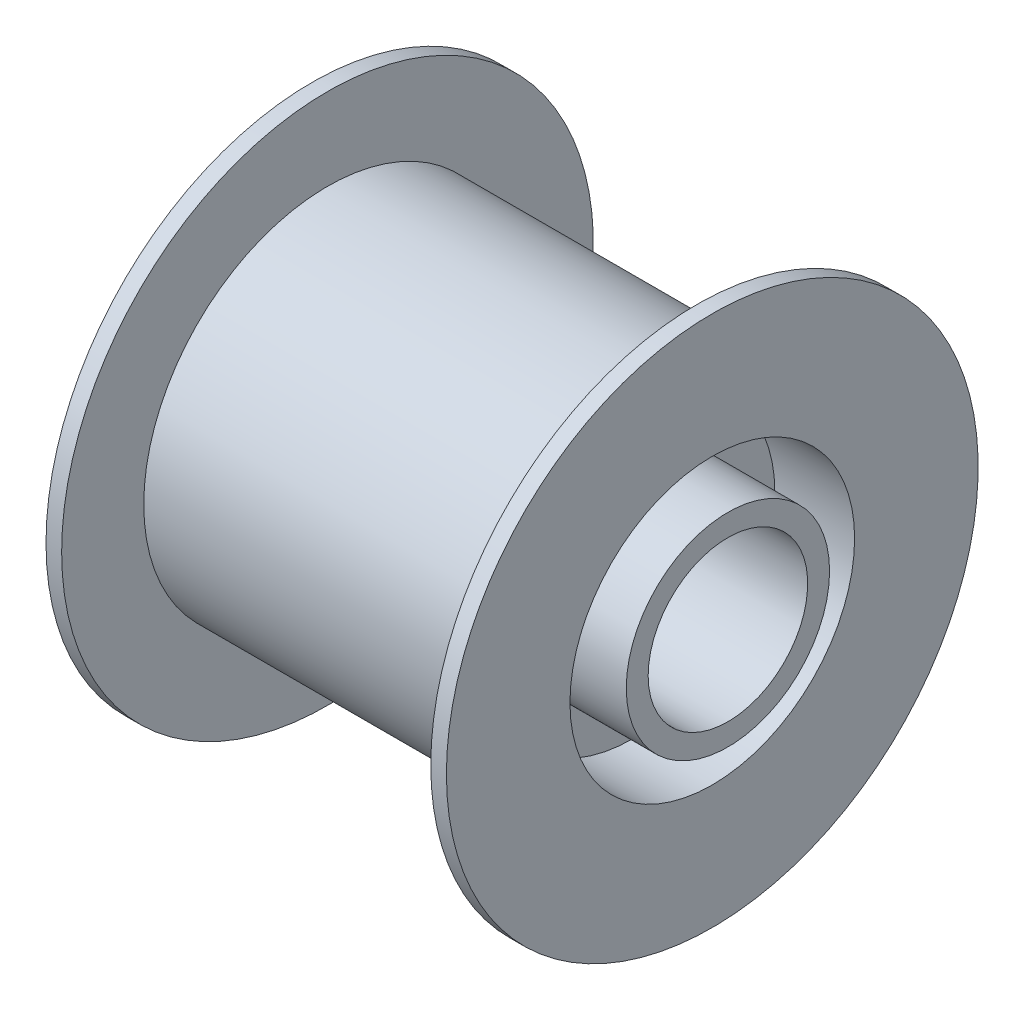
ISO-10303-21;
HEADER;
FILE_DESCRIPTION(('STEP AP214'),'2;1');
FILE_NAME('part.step','',(''),(''),'','','');
FILE_SCHEMA(('AUTOMOTIVE_DESIGN { 1 0 10303 214 1 1 1 1 }'));
ENDSEC;
DATA;
#1=APPLICATION_CONTEXT('core data for automotive mechanical design processes');
#2=APPLICATION_PROTOCOL_DEFINITION('international standard','automotive_design',2000,#1);
#3=PRODUCT_CONTEXT('',#1,'mechanical');
#4=PRODUCT('Part','Part','',(#3));
#5=PRODUCT_RELATED_PRODUCT_CATEGORY('part','',(#4));
#6=PRODUCT_DEFINITION_FORMATION('','',#4);
#7=PRODUCT_DEFINITION_CONTEXT('part definition',#1,'design');
#8=PRODUCT_DEFINITION('design','',#6,#7);
#9=PRODUCT_DEFINITION_SHAPE('','',#8);
#10=(LENGTH_UNIT() NAMED_UNIT(*) SI_UNIT(.MILLI.,.METRE.));
#11=(NAMED_UNIT(*) PLANE_ANGLE_UNIT() SI_UNIT($,.RADIAN.));
#12=(NAMED_UNIT(*) SI_UNIT($,.STERADIAN.) SOLID_ANGLE_UNIT());
#13=UNCERTAINTY_MEASURE_WITH_UNIT(LENGTH_MEASURE(1.E-05),#10,'distance_accuracy_value','');
#14=(GEOMETRIC_REPRESENTATION_CONTEXT(3) GLOBAL_UNCERTAINTY_ASSIGNED_CONTEXT((#13)) GLOBAL_UNIT_ASSIGNED_CONTEXT((#10,
#11,#12)) REPRESENTATION_CONTEXT('',''));
#15=CARTESIAN_POINT('',(0.,0.,0.));
#16=DIRECTION('',(0.,0.,1.));
#17=DIRECTION('',(1.,0.,0.));
#18=AXIS2_PLACEMENT_3D('',#15,#16,#17);
#19=CARTESIAN_POINT('',(0.,0.,0.));
#20=DIRECTION('',(-1.,0.,0.));
#21=DIRECTION('',(0.,0.,1.));
#22=AXIS2_PLACEMENT_3D('',#19,#20,#21);
#23=CYLINDRICAL_SURFACE('',#22,6.5);
#24=CARTESIAN_POINT('',(0.,0.,0.));
#25=DIRECTION('',(-1.,0.,0.));
#26=DIRECTION('',(0.,0.,1.));
#27=AXIS2_PLACEMENT_3D('',#24,#25,#26);
#28=CIRCLE('',#27,6.5);
#29=CARTESIAN_POINT('',(0.,0.,6.5));
#30=VERTEX_POINT('',#29);
#31=EDGE_CURVE('E10',#30,#30,#28,.T.);
#32=ORIENTED_EDGE('',*,*,#31,.F.);
#33=EDGE_LOOP('',(#32));
#34=FACE_BOUND('',#33,.T.);
#35=CARTESIAN_POINT('',(6.1,0.,0.));
#36=DIRECTION('',(-1.,0.,0.));
#37=DIRECTION('',(0.,0.,1.));
#38=AXIS2_PLACEMENT_3D('',#35,#36,#37);
#39=CIRCLE('',#38,6.5);
#40=CARTESIAN_POINT('',(6.1,0.,6.5));
#41=VERTEX_POINT('',#40);
#42=EDGE_CURVE('E86',#41,#41,#39,.T.);
#43=ORIENTED_EDGE('',*,*,#42,.T.);
#44=EDGE_LOOP('',(#43));
#45=FACE_BOUND('',#44,.T.);
#46=ADVANCED_FACE('F34',(#34,#45),#23,.T.);
#47=CARTESIAN_POINT('',(0.,6.5,0.));
#48=DIRECTION('',(1.,0.,0.));
#49=DIRECTION('',(0.,0.,-1.));
#50=AXIS2_PLACEMENT_3D('',#47,#48,#49);
#51=PLANE('',#50);
#52=CARTESIAN_POINT('',(0.,0.,0.));
#53=DIRECTION('',(-1.,0.,0.));
#54=DIRECTION('',(0.,0.,1.));
#55=AXIS2_PLACEMENT_3D('',#52,#53,#54);
#56=CIRCLE('',#55,5.1);
#57=CARTESIAN_POINT('',(0.,0.,5.1));
#58=VERTEX_POINT('',#57);
#59=EDGE_CURVE('E40',#58,#58,#56,.T.);
#60=ORIENTED_EDGE('',*,*,#59,.F.);
#61=EDGE_LOOP('',(#60));
#62=FACE_BOUND('',#61,.T.);
#63=ORIENTED_EDGE('',*,*,#31,.T.);
#64=EDGE_LOOP('',(#63));
#65=FACE_BOUND('',#64,.T.);
#66=ADVANCED_FACE('F171',(#62,#65),#51,.F.);
#67=CARTESIAN_POINT('',(0.,0.,0.));
#68=DIRECTION('',(-1.,0.,0.));
#69=DIRECTION('',(0.,0.,1.));
#70=AXIS2_PLACEMENT_3D('',#67,#68,#69);
#71=CYLINDRICAL_SURFACE('',#70,5.1);
#72=CARTESIAN_POINT('',(27.6,0.,0.));
#73=DIRECTION('',(-1.,0.,0.));
#74=DIRECTION('',(0.,0.,1.));
#75=AXIS2_PLACEMENT_3D('',#72,#73,#74);
#76=CIRCLE('',#75,5.1);
#77=CARTESIAN_POINT('',(27.6,0.,5.1));
#78=VERTEX_POINT('',#77);
#79=EDGE_CURVE('E44',#78,#78,#76,.T.);
#80=ORIENTED_EDGE('',*,*,#79,.F.);
#81=EDGE_LOOP('',(#80));
#82=FACE_BOUND('',#81,.T.);
#83=ORIENTED_EDGE('',*,*,#59,.T.);
#84=EDGE_LOOP('',(#83));
#85=FACE_BOUND('',#84,.T.);
#86=ADVANCED_FACE('F166',(#82,#85),#71,.F.);
#87=CARTESIAN_POINT('',(27.6,5.1,0.));
#88=DIRECTION('',(-1.,0.,0.));
#89=DIRECTION('',(0.,0.,1.));
#90=AXIS2_PLACEMENT_3D('',#87,#88,#89);
#91=PLANE('',#90);
#92=CARTESIAN_POINT('',(27.6,0.,0.));
#93=DIRECTION('',(-1.,0.,0.));
#94=DIRECTION('',(0.,0.,1.));
#95=AXIS2_PLACEMENT_3D('',#92,#93,#94);
#96=CIRCLE('',#95,6.5);
#97=CARTESIAN_POINT('',(27.6,0.,6.5));
#98=VERTEX_POINT('',#97);
#99=EDGE_CURVE('E48',#98,#98,#96,.T.);
#100=ORIENTED_EDGE('',*,*,#99,.F.);
#101=EDGE_LOOP('',(#100));
#102=FACE_BOUND('',#101,.T.);
#103=ORIENTED_EDGE('',*,*,#79,.T.);
#104=EDGE_LOOP('',(#103));
#105=FACE_BOUND('',#104,.T.);
#106=ADVANCED_FACE('F160',(#102,#105),#91,.F.);
#107=CARTESIAN_POINT('',(0.,0.,0.));
#108=DIRECTION('',(-1.,0.,0.));
#109=DIRECTION('',(0.,0.,1.));
#110=AXIS2_PLACEMENT_3D('',#107,#108,#109);
#111=CYLINDRICAL_SURFACE('',#110,6.5);
#112=CARTESIAN_POINT('',(21.5,0.,0.));
#113=DIRECTION('',(-1.,0.,0.));
#114=DIRECTION('',(0.,0.,1.));
#115=AXIS2_PLACEMENT_3D('',#112,#113,#114);
#116=CIRCLE('',#115,6.5);
#117=CARTESIAN_POINT('',(21.5,0.,6.5));
#118=VERTEX_POINT('',#117);
#119=EDGE_CURVE('E53',#118,#118,#116,.T.);
#120=ORIENTED_EDGE('',*,*,#119,.F.);
#121=EDGE_LOOP('',(#120));
#122=FACE_BOUND('',#121,.T.);
#123=ORIENTED_EDGE('',*,*,#99,.T.);
#124=EDGE_LOOP('',(#123));
#125=FACE_BOUND('',#124,.T.);
#126=ADVANCED_FACE('F154',(#122,#125),#111,.T.);
#127=CARTESIAN_POINT('',(21.5,6.5,0.));
#128=DIRECTION('',(-1.,0.,0.));
#129=DIRECTION('',(0.,0.,1.));
#130=AXIS2_PLACEMENT_3D('',#127,#128,#129);
#131=PLANE('',#130);
#132=CARTESIAN_POINT('',(21.5,0.,0.));
#133=DIRECTION('',(-1.,0.,0.));
#134=DIRECTION('',(0.,0.,1.));
#135=AXIS2_PLACEMENT_3D('',#132,#133,#134);
#136=CIRCLE('',#135,9.1);
#137=CARTESIAN_POINT('',(21.5,0.,9.1));
#138=VERTEX_POINT('',#137);
#139=EDGE_CURVE('E56',#138,#138,#136,.T.);
#140=ORIENTED_EDGE('',*,*,#139,.F.);
#141=EDGE_LOOP('',(#140));
#142=FACE_BOUND('',#141,.T.);
#143=ORIENTED_EDGE('',*,*,#119,.T.);
#144=EDGE_LOOP('',(#143));
#145=FACE_BOUND('',#144,.T.);
#146=ADVANCED_FACE('F148',(#142,#145),#131,.F.);
#147=CARTESIAN_POINT('',(0.,0.,0.));
#148=DIRECTION('',(-1.,0.,0.));
#149=DIRECTION('',(0.,0.,1.));
#150=AXIS2_PLACEMENT_3D('',#147,#148,#149);
#151=CYLINDRICAL_SURFACE('',#150,9.1);
#152=CARTESIAN_POINT('',(26.6,0.,0.));
#153=DIRECTION('',(-1.,0.,0.));
#154=DIRECTION('',(0.,0.,1.));
#155=AXIS2_PLACEMENT_3D('',#152,#153,#154);
#156=CIRCLE('',#155,9.1);
#157=CARTESIAN_POINT('',(26.6,0.,9.1));
#158=VERTEX_POINT('',#157);
#159=EDGE_CURVE('E59',#158,#158,#156,.T.);
#160=ORIENTED_EDGE('',*,*,#159,.F.);
#161=EDGE_LOOP('',(#160));
#162=FACE_BOUND('',#161,.T.);
#163=ORIENTED_EDGE('',*,*,#139,.T.);
#164=EDGE_LOOP('',(#163));
#165=FACE_BOUND('',#164,.T.);
#166=ADVANCED_FACE('F142',(#162,#165),#151,.F.);
#167=CARTESIAN_POINT('',(26.6,17.,0.));
#168=DIRECTION('',(-1.,0.,0.));
#169=DIRECTION('',(0.,0.,1.));
#170=AXIS2_PLACEMENT_3D('',#167,#168,#169);
#171=PLANE('',#170);
#172=CARTESIAN_POINT('',(26.6,0.,0.));
#173=DIRECTION('',(-1.,0.,0.));
#174=DIRECTION('',(0.,0.,1.));
#175=AXIS2_PLACEMENT_3D('',#172,#173,#174);
#176=CIRCLE('',#175,17.);
#177=CARTESIAN_POINT('',(26.6,0.,17.));
#178=VERTEX_POINT('',#177);
#179=EDGE_CURVE('E62',#178,#178,#176,.T.);
#180=ORIENTED_EDGE('',*,*,#179,.F.);
#181=EDGE_LOOP('',(#180));
#182=FACE_BOUND('',#181,.T.);
#183=ORIENTED_EDGE('',*,*,#159,.T.);
#184=EDGE_LOOP('',(#183));
#185=FACE_BOUND('',#184,.T.);
#186=ADVANCED_FACE('F136',(#182,#185),#171,.F.);
#187=CARTESIAN_POINT('',(0.,0.,0.));
#188=DIRECTION('',(-1.,0.,0.));
#189=DIRECTION('',(0.,0.,1.));
#190=AXIS2_PLACEMENT_3D('',#187,#188,#189);
#191=CYLINDRICAL_SURFACE('',#190,17.);
#192=CARTESIAN_POINT('',(25.6,0.,0.));
#193=DIRECTION('',(-1.,0.,0.));
#194=DIRECTION('',(0.,0.,1.));
#195=AXIS2_PLACEMENT_3D('',#192,#193,#194);
#196=CIRCLE('',#195,17.);
#197=CARTESIAN_POINT('',(25.6,0.,17.));
#198=VERTEX_POINT('',#197);
#199=EDGE_CURVE('E65',#198,#198,#196,.T.);
#200=ORIENTED_EDGE('',*,*,#199,.F.);
#201=EDGE_LOOP('',(#200));
#202=FACE_BOUND('',#201,.T.);
#203=ORIENTED_EDGE('',*,*,#179,.T.);
#204=EDGE_LOOP('',(#203));
#205=FACE_BOUND('',#204,.T.);
#206=ADVANCED_FACE('F130',(#202,#205),#191,.T.);
#207=CARTESIAN_POINT('',(25.6,11.75,0.));
#208=DIRECTION('',(1.,0.,0.));
#209=DIRECTION('',(0.,0.,-1.));
#210=AXIS2_PLACEMENT_3D('',#207,#208,#209);
#211=PLANE('',#210);
#212=CARTESIAN_POINT('',(25.6,0.,0.));
#213=DIRECTION('',(-1.,0.,0.));
#214=DIRECTION('',(0.,0.,1.));
#215=AXIS2_PLACEMENT_3D('',#212,#213,#214);
#216=CIRCLE('',#215,11.75);
#217=CARTESIAN_POINT('',(25.6,0.,11.75));
#218=VERTEX_POINT('',#217);
#219=EDGE_CURVE('E68',#218,#218,#216,.T.);
#220=ORIENTED_EDGE('',*,*,#219,.F.);
#221=EDGE_LOOP('',(#220));
#222=FACE_BOUND('',#221,.T.);
#223=ORIENTED_EDGE('',*,*,#199,.T.);
#224=EDGE_LOOP('',(#223));
#225=FACE_BOUND('',#224,.T.);
#226=ADVANCED_FACE('F124',(#222,#225),#211,.F.);
#227=CARTESIAN_POINT('',(0.,0.,0.));
#228=DIRECTION('',(-1.,0.,0.));
#229=DIRECTION('',(0.,0.,1.));
#230=AXIS2_PLACEMENT_3D('',#227,#228,#229);
#231=CYLINDRICAL_SURFACE('',#230,11.75);
#232=CARTESIAN_POINT('',(2.,0.,0.));
#233=DIRECTION('',(-1.,0.,0.));
#234=DIRECTION('',(0.,0.,1.));
#235=AXIS2_PLACEMENT_3D('',#232,#233,#234);
#236=CIRCLE('',#235,11.75);
#237=CARTESIAN_POINT('',(2.,0.,11.75));
#238=VERTEX_POINT('',#237);
#239=EDGE_CURVE('E71',#238,#238,#236,.T.);
#240=ORIENTED_EDGE('',*,*,#239,.F.);
#241=EDGE_LOOP('',(#240));
#242=FACE_BOUND('',#241,.T.);
#243=ORIENTED_EDGE('',*,*,#219,.T.);
#244=EDGE_LOOP('',(#243));
#245=FACE_BOUND('',#244,.T.);
#246=ADVANCED_FACE('F118',(#242,#245),#231,.T.);
#247=CARTESIAN_POINT('',(2.,17.,0.));
#248=DIRECTION('',(-1.,0.,0.));
#249=DIRECTION('',(0.,0.,1.));
#250=AXIS2_PLACEMENT_3D('',#247,#248,#249);
#251=PLANE('',#250);
#252=CARTESIAN_POINT('',(2.,0.,0.));
#253=DIRECTION('',(-1.,0.,0.));
#254=DIRECTION('',(0.,0.,1.));
#255=AXIS2_PLACEMENT_3D('',#252,#253,#254);
#256=CIRCLE('',#255,17.);
#257=CARTESIAN_POINT('',(2.,0.,17.));
#258=VERTEX_POINT('',#257);
#259=EDGE_CURVE('E74',#258,#258,#256,.T.);
#260=ORIENTED_EDGE('',*,*,#259,.F.);
#261=EDGE_LOOP('',(#260));
#262=FACE_BOUND('',#261,.T.);
#263=ORIENTED_EDGE('',*,*,#239,.T.);
#264=EDGE_LOOP('',(#263));
#265=FACE_BOUND('',#264,.T.);
#266=ADVANCED_FACE('F112',(#262,#265),#251,.F.);
#267=CARTESIAN_POINT('',(0.,0.,0.));
#268=DIRECTION('',(-1.,0.,0.));
#269=DIRECTION('',(0.,0.,1.));
#270=AXIS2_PLACEMENT_3D('',#267,#268,#269);
#271=CYLINDRICAL_SURFACE('',#270,17.);
#272=CARTESIAN_POINT('',(1.,0.,0.));
#273=DIRECTION('',(-1.,0.,0.));
#274=DIRECTION('',(0.,0.,1.));
#275=AXIS2_PLACEMENT_3D('',#272,#273,#274);
#276=CIRCLE('',#275,17.);
#277=CARTESIAN_POINT('',(1.,0.,17.));
#278=VERTEX_POINT('',#277);
#279=EDGE_CURVE('E77',#278,#278,#276,.T.);
#280=ORIENTED_EDGE('',*,*,#279,.F.);
#281=EDGE_LOOP('',(#280));
#282=FACE_BOUND('',#281,.T.);
#283=ORIENTED_EDGE('',*,*,#259,.T.);
#284=EDGE_LOOP('',(#283));
#285=FACE_BOUND('',#284,.T.);
#286=ADVANCED_FACE('F106',(#282,#285),#271,.T.);
#287=CARTESIAN_POINT('',(1.,9.1,0.));
#288=DIRECTION('',(1.,0.,0.));
#289=DIRECTION('',(0.,0.,-1.));
#290=AXIS2_PLACEMENT_3D('',#287,#288,#289);
#291=PLANE('',#290);
#292=CARTESIAN_POINT('',(1.,0.,0.));
#293=DIRECTION('',(-1.,0.,0.));
#294=DIRECTION('',(0.,0.,1.));
#295=AXIS2_PLACEMENT_3D('',#292,#293,#294);
#296=CIRCLE('',#295,9.1);
#297=CARTESIAN_POINT('',(1.,0.,9.1));
#298=VERTEX_POINT('',#297);
#299=EDGE_CURVE('E80',#298,#298,#296,.T.);
#300=ORIENTED_EDGE('',*,*,#299,.F.);
#301=EDGE_LOOP('',(#300));
#302=FACE_BOUND('',#301,.T.);
#303=ORIENTED_EDGE('',*,*,#279,.T.);
#304=EDGE_LOOP('',(#303));
#305=FACE_BOUND('',#304,.T.);
#306=ADVANCED_FACE('F100',(#302,#305),#291,.F.);
#307=CARTESIAN_POINT('',(0.,0.,0.));
#308=DIRECTION('',(-1.,0.,0.));
#309=DIRECTION('',(0.,0.,1.));
#310=AXIS2_PLACEMENT_3D('',#307,#308,#309);
#311=CYLINDRICAL_SURFACE('',#310,9.1);
#312=CARTESIAN_POINT('',(6.1,0.,0.));
#313=DIRECTION('',(-1.,0.,0.));
#314=DIRECTION('',(0.,0.,1.));
#315=AXIS2_PLACEMENT_3D('',#312,#313,#314);
#316=CIRCLE('',#315,9.1);
#317=CARTESIAN_POINT('',(6.1,0.,9.1));
#318=VERTEX_POINT('',#317);
#319=EDGE_CURVE('E83',#318,#318,#316,.T.);
#320=ORIENTED_EDGE('',*,*,#319,.F.);
#321=EDGE_LOOP('',(#320));
#322=FACE_BOUND('',#321,.T.);
#323=ORIENTED_EDGE('',*,*,#299,.T.);
#324=EDGE_LOOP('',(#323));
#325=FACE_BOUND('',#324,.T.);
#326=ADVANCED_FACE('F94',(#322,#325),#311,.F.);
#327=CARTESIAN_POINT('',(6.1,6.5,0.));
#328=DIRECTION('',(1.,0.,0.));
#329=DIRECTION('',(0.,0.,-1.));
#330=AXIS2_PLACEMENT_3D('',#327,#328,#329);
#331=PLANE('',#330);
#332=ORIENTED_EDGE('',*,*,#42,.F.);
#333=EDGE_LOOP('',(#332));
#334=FACE_BOUND('',#333,.T.);
#335=ORIENTED_EDGE('',*,*,#319,.T.);
#336=EDGE_LOOP('',(#335));
#337=FACE_BOUND('',#336,.T.);
#338=ADVANCED_FACE('F91',(#334,#337),#331,.F.);
#339=CLOSED_SHELL('',(#46,#66,#86,#106,#126,#146,#166,#186,#206,#226,#246,#266,#286,#306,#326,#338));
#340=MANIFOLD_SOLID_BREP('B2',#339);
#341=ADVANCED_BREP_SHAPE_REPRESENTATION('',(#18,#340),#14);
#342=SHAPE_DEFINITION_REPRESENTATION(#9,#341);
ENDSEC;
END-ISO-10303-21;
